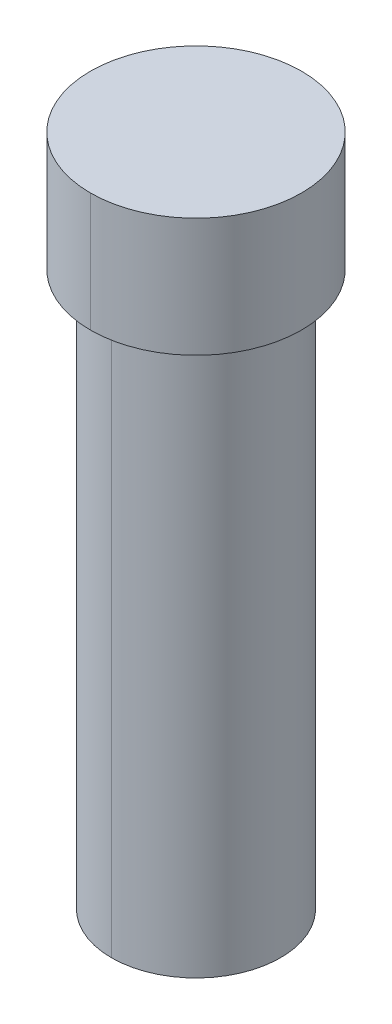
ISO-10303-21;
HEADER;
FILE_DESCRIPTION(('STEP AP214'),'2;1');
FILE_NAME('part.step','',(''),(''),'','','');
FILE_SCHEMA(('AUTOMOTIVE_DESIGN { 1 0 10303 214 1 1 1 1 }'));
ENDSEC;
DATA;
#1=APPLICATION_CONTEXT('core data for automotive mechanical design processes');
#2=APPLICATION_PROTOCOL_DEFINITION('international standard','automotive_design',2000,#1);
#3=PRODUCT_CONTEXT('',#1,'mechanical');
#4=PRODUCT('Part','Part','',(#3));
#5=PRODUCT_RELATED_PRODUCT_CATEGORY('part','',(#4));
#6=PRODUCT_DEFINITION_FORMATION('','',#4);
#7=PRODUCT_DEFINITION_CONTEXT('part definition',#1,'design');
#8=PRODUCT_DEFINITION('design','',#6,#7);
#9=PRODUCT_DEFINITION_SHAPE('','',#8);
#10=(LENGTH_UNIT() NAMED_UNIT(*) SI_UNIT(.MILLI.,.METRE.));
#11=(NAMED_UNIT(*) PLANE_ANGLE_UNIT() SI_UNIT($,.RADIAN.));
#12=(NAMED_UNIT(*) SI_UNIT($,.STERADIAN.) SOLID_ANGLE_UNIT());
#13=UNCERTAINTY_MEASURE_WITH_UNIT(LENGTH_MEASURE(1.E-05),#10,'distance_accuracy_value','');
#14=(GEOMETRIC_REPRESENTATION_CONTEXT(3) GLOBAL_UNCERTAINTY_ASSIGNED_CONTEXT((#13)) GLOBAL_UNIT_ASSIGNED_CONTEXT((#10,
#11,#12)) REPRESENTATION_CONTEXT('',''));
#15=CARTESIAN_POINT('',(0.,0.,0.));
#16=DIRECTION('',(0.,0.,1.));
#17=DIRECTION('',(1.,0.,0.));
#18=AXIS2_PLACEMENT_3D('',#15,#16,#17);
#19=CARTESIAN_POINT('',(0.,53.34,0.));
#20=DIRECTION('',(0.,1.,0.));
#21=DIRECTION('',(1.,0.,0.));
#22=AXIS2_PLACEMENT_3D('',#19,#20,#21);
#23=PLANE('',#22);
#24=CARTESIAN_POINT('',(0.,53.34,0.));
#25=DIRECTION('',(0.,1.,0.));
#26=DIRECTION('',(0.,0.,1.));
#27=AXIS2_PLACEMENT_3D('',#24,#25,#26);
#28=CIRCLE('',#27,8.1407);
#29=CARTESIAN_POINT('',(0.,53.34,-8.1407));
#30=VERTEX_POINT('',#29);
#31=CARTESIAN_POINT('',(0.,53.34,8.1407));
#32=VERTEX_POINT('',#31);
#33=EDGE_CURVE('E104',#30,#32,#28,.T.);
#34=ORIENTED_EDGE('',*,*,#33,.T.);
#35=CARTESIAN_POINT('',(0.,53.34,0.));
#36=DIRECTION('',(0.,1.,0.));
#37=DIRECTION('',(0.,0.,1.));
#38=AXIS2_PLACEMENT_3D('',#35,#36,#37);
#39=CIRCLE('',#38,8.1407);
#40=EDGE_CURVE('E81',#32,#30,#39,.T.);
#41=ORIENTED_EDGE('',*,*,#40,.T.);
#42=EDGE_LOOP('',(#34,#41));
#43=FACE_BOUND('',#42,.T.);
#44=CARTESIAN_POINT('',(0.,53.34,0.));
#45=DIRECTION('',(0.,1.,0.));
#46=DIRECTION('',(0.,0.,1.));
#47=AXIS2_PLACEMENT_3D('',#44,#45,#46);
#48=CIRCLE('',#47,10.16);
#49=CARTESIAN_POINT('',(0.,53.34,-10.16));
#50=VERTEX_POINT('',#49);
#51=CARTESIAN_POINT('',(0.,53.34,10.16));
#52=VERTEX_POINT('',#51);
#53=EDGE_CURVE('E11',#50,#52,#48,.T.);
#54=ORIENTED_EDGE('',*,*,#53,.F.);
#55=CARTESIAN_POINT('',(0.,53.34,0.));
#56=DIRECTION('',(0.,1.,0.));
#57=DIRECTION('',(0.,0.,1.));
#58=AXIS2_PLACEMENT_3D('',#55,#56,#57);
#59=CIRCLE('',#58,10.16);
#60=EDGE_CURVE('E79',#52,#50,#59,.T.);
#61=ORIENTED_EDGE('',*,*,#60,.F.);
#62=EDGE_LOOP('',(#54,#61));
#63=FACE_BOUND('',#62,.T.);
#64=ADVANCED_FACE('F16',(#43,#63),#23,.F.);
#65=CARTESIAN_POINT('',(0.,64.77,0.));
#66=DIRECTION('',(0.,1.,0.));
#67=DIRECTION('',(1.,0.,0.));
#68=AXIS2_PLACEMENT_3D('',#65,#66,#67);
#69=PLANE('',#68);
#70=CARTESIAN_POINT('',(0.,64.77,0.));
#71=DIRECTION('',(0.,1.,0.));
#72=DIRECTION('',(0.,0.,1.));
#73=AXIS2_PLACEMENT_3D('',#70,#71,#72);
#74=CIRCLE('',#73,10.16);
#75=CARTESIAN_POINT('',(0.,64.77,-10.16));
#76=VERTEX_POINT('',#75);
#77=CARTESIAN_POINT('',(0.,64.77,10.16));
#78=VERTEX_POINT('',#77);
#79=EDGE_CURVE('E27',#76,#78,#74,.T.);
#80=ORIENTED_EDGE('',*,*,#79,.T.);
#81=CARTESIAN_POINT('',(0.,64.77,0.));
#82=DIRECTION('',(0.,1.,0.));
#83=DIRECTION('',(0.,0.,1.));
#84=AXIS2_PLACEMENT_3D('',#81,#82,#83);
#85=CIRCLE('',#84,10.16);
#86=EDGE_CURVE('E77',#78,#76,#85,.T.);
#87=ORIENTED_EDGE('',*,*,#86,.T.);
#88=EDGE_LOOP('',(#80,#87));
#89=FACE_BOUND('',#88,.T.);
#90=ADVANCED_FACE('F18',(#89),#69,.T.);
#91=CARTESIAN_POINT('',(0.,64.77,0.));
#92=DIRECTION('',(0.,-1.,0.));
#93=DIRECTION('',(0.,0.,-1.));
#94=AXIS2_PLACEMENT_3D('',#91,#92,#93);
#95=CYLINDRICAL_SURFACE('',#94,10.16);
#96=DIRECTION('',(0.,-1.,0.));
#97=VECTOR('',#96,1.);
#98=CARTESIAN_POINT('',(0.,64.77,10.16));
#99=LINE('',#98,#97);
#100=EDGE_CURVE('E69',#78,#52,#99,.T.);
#101=ORIENTED_EDGE('',*,*,#100,.F.);
#102=ORIENTED_EDGE('',*,*,#79,.F.);
#103=DIRECTION('',(0.,-1.,0.));
#104=VECTOR('',#103,1.);
#105=CARTESIAN_POINT('',(0.,64.77,-10.16));
#106=LINE('',#105,#104);
#107=EDGE_CURVE('E66',#76,#50,#106,.T.);
#108=ORIENTED_EDGE('',*,*,#107,.T.);
#109=ORIENTED_EDGE('',*,*,#53,.T.);
#110=EDGE_LOOP('',(#101,#102,#108,#109));
#111=FACE_BOUND('',#110,.T.);
#112=ADVANCED_FACE('F65',(#111),#95,.T.);
#113=CARTESIAN_POINT('',(0.,0.,0.));
#114=DIRECTION('',(0.,1.,0.));
#115=DIRECTION('',(1.,0.,0.));
#116=AXIS2_PLACEMENT_3D('',#113,#114,#115);
#117=PLANE('',#116);
#118=CARTESIAN_POINT('',(0.,0.,0.));
#119=DIRECTION('',(0.,1.,0.));
#120=DIRECTION('',(0.,0.,1.));
#121=AXIS2_PLACEMENT_3D('',#118,#119,#120);
#122=CIRCLE('',#121,8.1407);
#123=CARTESIAN_POINT('',(0.,0.,-8.1407));
#124=VERTEX_POINT('',#123);
#125=CARTESIAN_POINT('',(0.,0.,8.1407));
#126=VERTEX_POINT('',#125);
#127=EDGE_CURVE('E20',#124,#126,#122,.T.);
#128=ORIENTED_EDGE('',*,*,#127,.F.);
#129=CARTESIAN_POINT('',(0.,0.,0.));
#130=DIRECTION('',(0.,1.,0.));
#131=DIRECTION('',(0.,0.,1.));
#132=AXIS2_PLACEMENT_3D('',#129,#130,#131);
#133=CIRCLE('',#132,8.1407);
#134=EDGE_CURVE('E95',#126,#124,#133,.T.);
#135=ORIENTED_EDGE('',*,*,#134,.F.);
#136=EDGE_LOOP('',(#128,#135));
#137=FACE_BOUND('',#136,.T.);
#138=ADVANCED_FACE('F157',(#137),#117,.F.);
#139=CARTESIAN_POINT('',(0.,53.34,0.));
#140=DIRECTION('',(0.,-1.,0.));
#141=DIRECTION('',(0.,0.,-1.));
#142=AXIS2_PLACEMENT_3D('',#139,#140,#141);
#143=CYLINDRICAL_SURFACE('',#142,8.1407);
#144=DIRECTION('',(0.,-1.,0.));
#145=VECTOR('',#144,1.);
#146=CARTESIAN_POINT('',(0.,53.34,8.1407));
#147=LINE('',#146,#145);
#148=EDGE_CURVE('E91',#32,#126,#147,.T.);
#149=ORIENTED_EDGE('',*,*,#148,.F.);
#150=ORIENTED_EDGE('',*,*,#33,.F.);
#151=DIRECTION('',(0.,-1.,0.));
#152=VECTOR('',#151,1.);
#153=CARTESIAN_POINT('',(0.,53.34,-8.1407));
#154=LINE('',#153,#152);
#155=EDGE_CURVE('E98',#30,#124,#154,.T.);
#156=ORIENTED_EDGE('',*,*,#155,.T.);
#157=ORIENTED_EDGE('',*,*,#127,.T.);
#158=EDGE_LOOP('',(#149,#150,#156,#157));
#159=FACE_BOUND('',#158,.T.);
#160=ADVANCED_FACE('F172',(#159),#143,.T.);
#161=CARTESIAN_POINT('',(0.,53.34,0.));
#162=DIRECTION('',(0.,-1.,0.));
#163=DIRECTION('',(0.,0.,-1.));
#164=AXIS2_PLACEMENT_3D('',#161,#162,#163);
#165=CYLINDRICAL_SURFACE('',#164,8.1407);
#166=ORIENTED_EDGE('',*,*,#40,.F.);
#167=ORIENTED_EDGE('',*,*,#148,.T.);
#168=ORIENTED_EDGE('',*,*,#134,.T.);
#169=ORIENTED_EDGE('',*,*,#155,.F.);
#170=EDGE_LOOP('',(#166,#167,#168,#169));
#171=FACE_BOUND('',#170,.T.);
#172=ADVANCED_FACE('F167',(#171),#165,.T.);
#173=CARTESIAN_POINT('',(0.,64.77,0.));
#174=DIRECTION('',(0.,-1.,0.));
#175=DIRECTION('',(0.,0.,-1.));
#176=AXIS2_PLACEMENT_3D('',#173,#174,#175);
#177=CYLINDRICAL_SURFACE('',#176,10.16);
#178=ORIENTED_EDGE('',*,*,#86,.F.);
#179=ORIENTED_EDGE('',*,*,#100,.T.);
#180=ORIENTED_EDGE('',*,*,#60,.T.);
#181=ORIENTED_EDGE('',*,*,#107,.F.);
#182=EDGE_LOOP('',(#178,#179,#180,#181));
#183=FACE_BOUND('',#182,.T.);
#184=ADVANCED_FACE('F76',(#183),#177,.T.);
#185=CLOSED_SHELL('',(#64,#90,#112,#138,#160,#172,#184));
#186=MANIFOLD_SOLID_BREP('B1',#185);
#187=ADVANCED_BREP_SHAPE_REPRESENTATION('',(#18,#186),#14);
#188=SHAPE_DEFINITION_REPRESENTATION(#9,#187);
ENDSEC;
END-ISO-10303-21;
